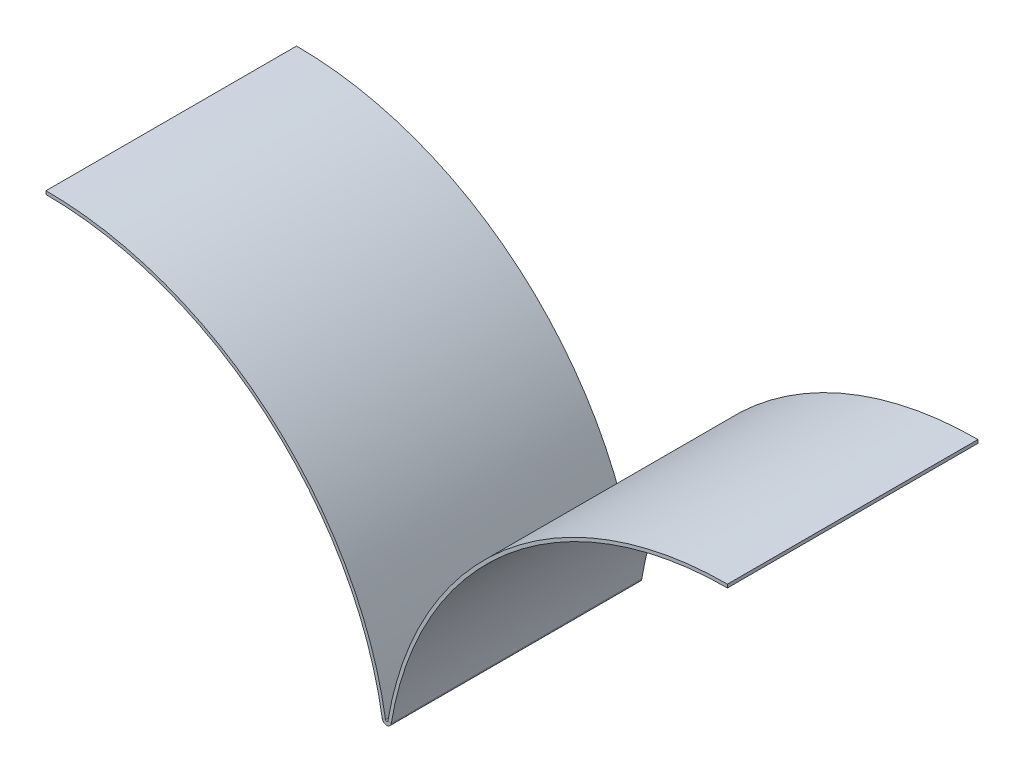
ISO-10303-21;
HEADER;
FILE_DESCRIPTION(('STEP AP214'),'2;1');
FILE_NAME('part.step','',(''),(''),'','','');
FILE_SCHEMA(('AUTOMOTIVE_DESIGN { 1 0 10303 214 1 1 1 1 }'));
ENDSEC;
DATA;
#1=APPLICATION_CONTEXT('core data for automotive mechanical design processes');
#2=APPLICATION_PROTOCOL_DEFINITION('international standard','automotive_design',2000,#1);
#3=PRODUCT_CONTEXT('',#1,'mechanical');
#4=PRODUCT('Part','Part','',(#3));
#5=PRODUCT_RELATED_PRODUCT_CATEGORY('part','',(#4));
#6=PRODUCT_DEFINITION_FORMATION('','',#4);
#7=PRODUCT_DEFINITION_CONTEXT('part definition',#1,'design');
#8=PRODUCT_DEFINITION('design','',#6,#7);
#9=PRODUCT_DEFINITION_SHAPE('','',#8);
#10=(LENGTH_UNIT() NAMED_UNIT(*) SI_UNIT(.MILLI.,.METRE.));
#11=(NAMED_UNIT(*) PLANE_ANGLE_UNIT() SI_UNIT($,.RADIAN.));
#12=(NAMED_UNIT(*) SI_UNIT($,.STERADIAN.) SOLID_ANGLE_UNIT());
#13=UNCERTAINTY_MEASURE_WITH_UNIT(LENGTH_MEASURE(1.E-05),#10,'distance_accuracy_value','');
#14=(GEOMETRIC_REPRESENTATION_CONTEXT(3) GLOBAL_UNCERTAINTY_ASSIGNED_CONTEXT((#13)) GLOBAL_UNIT_ASSIGNED_CONTEXT((#10,
#11,#12)) REPRESENTATION_CONTEXT('',''));
#15=CARTESIAN_POINT('',(0.,0.,0.));
#16=DIRECTION('',(0.,0.,1.));
#17=DIRECTION('',(1.,0.,0.));
#18=AXIS2_PLACEMENT_3D('',#15,#16,#17);
#19=CARTESIAN_POINT('',(-71.7628752601135,-88.5736098456698,150.));
#20=DIRECTION('',(0.,0.,1.));
#21=DIRECTION('',(1.,0.,0.));
#22=AXIS2_PLACEMENT_3D('',#19,#20,#21);
#23=PLANE('',#22);
#24=DIRECTION('',(0.986762866371992,0.162169804678092,0.));
#25=VECTOR('',#24,1.);
#26=CARTESIAN_POINT('',(-71.7628752601135,-88.5736098456698,150.));
#27=LINE('',#26,#25);
#28=CARTESIAN_POINT('',(-71.7628752601135,-88.5736098456698,150.));
#29=VERTEX_POINT('',#28);
#30=CARTESIAN_POINT('',(-69.7893495273696,-88.2492702363136,150.));
#31=VERTEX_POINT('',#30);
#32=EDGE_CURVE('E11',#29,#31,#27,.T.);
#33=ORIENTED_EDGE('',*,*,#32,.F.);
#34=CARTESIAN_POINT('',(-69.0624999999999,-88.1298159581877,150.));
#35=DIRECTION('',(0.,0.,1.));
#36=DIRECTION('',(1.,0.,0.));
#37=AXIS2_PLACEMENT_3D('',#34,#35,#36);
#38=CIRCLE('',#37,2.7366);
#39=CARTESIAN_POINT('',(-66.3621247398864,-88.5736098456698,150.));
#40=VERTEX_POINT('',#39);
#41=EDGE_CURVE('E134',#40,#29,#38,.F.);
#42=ORIENTED_EDGE('',*,*,#41,.F.);
#43=DIRECTION('',(0.986762866371992,-0.162169804678093,0.));
#44=VECTOR('',#43,1.);
#45=CARTESIAN_POINT('',(-68.3356504726303,-88.2492702363136,150.));
#46=LINE('',#45,#44);
#47=CARTESIAN_POINT('',(-68.3356504726303,-88.2492702363136,150.));
#48=VERTEX_POINT('',#47);
#49=EDGE_CURVE('E45',#48,#40,#46,.T.);
#50=ORIENTED_EDGE('',*,*,#49,.F.);
#51=CARTESIAN_POINT('',(-69.0624999999999,-88.1298159581877,150.));
#52=DIRECTION('',(0.,0.,1.));
#53=DIRECTION('',(1.,0.,0.));
#54=AXIS2_PLACEMENT_3D('',#51,#52,#53);
#55=CIRCLE('',#54,0.7366);
#56=EDGE_CURVE('E127',#48,#31,#55,.F.);
#57=ORIENTED_EDGE('',*,*,#56,.T.);
#58=EDGE_LOOP('',(#33,#42,#50,#57));
#59=FACE_BOUND('',#58,.T.);
#60=ADVANCED_FACE('F37',(#59),#23,.T.);
#61=CARTESIAN_POINT('',(-68.3356504726303,-88.2492702363136,150.));
#62=DIRECTION('',(0.,0.,1.));
#63=DIRECTION('',(1.,0.,0.));
#64=AXIS2_PLACEMENT_3D('',#61,#62,#63);
#65=PLANE('',#64);
#66=CARTESIAN_POINT('',(-273.0625,-121.65625,150.));
#67=DIRECTION('',(0.,0.,1.));
#68=DIRECTION('',(1.,0.,0.));
#69=AXIS2_PLACEMENT_3D('',#66,#67,#68);
#70=CIRCLE('',#69,204.);
#71=CARTESIAN_POINT('',(-273.0625,82.34375,150.));
#72=VERTEX_POINT('',#71);
#73=EDGE_CURVE('E183',#29,#72,#70,.T.);
#74=ORIENTED_EDGE('',*,*,#73,.F.);
#75=ORIENTED_EDGE('',*,*,#32,.T.);
#76=CARTESIAN_POINT('',(-273.0625,-121.65625,150.));
#77=DIRECTION('',(0.,0.,1.));
#78=DIRECTION('',(1.,0.,0.));
#79=AXIS2_PLACEMENT_3D('',#76,#77,#78);
#80=CIRCLE('',#79,206.);
#81=CARTESIAN_POINT('',(-273.0625,84.34375,150.));
#82=VERTEX_POINT('',#81);
#83=EDGE_CURVE('E93',#31,#82,#80,.T.);
#84=ORIENTED_EDGE('',*,*,#83,.T.);
#85=DIRECTION('',(0.,1.,0.));
#86=VECTOR('',#85,1.);
#87=CARTESIAN_POINT('',(-273.0625,82.34375,150.));
#88=LINE('',#87,#86);
#89=EDGE_CURVE('E340',#72,#82,#88,.T.);
#90=ORIENTED_EDGE('',*,*,#89,.F.);
#91=EDGE_LOOP('',(#74,#75,#84,#90));
#92=FACE_BOUND('',#91,.T.);
#93=ADVANCED_FACE('F191',(#92),#65,.T.);
#94=CARTESIAN_POINT('',(-66.3621247398864,-88.5736098456698,0.));
#95=DIRECTION('',(0.,0.,-1.));
#96=DIRECTION('',(-1.,0.,0.));
#97=AXIS2_PLACEMENT_3D('',#94,#95,#96);
#98=PLANE('',#97);
#99=DIRECTION('',(-0.986762866371992,0.162169804678093,0.));
#100=VECTOR('',#99,1.);
#101=CARTESIAN_POINT('',(-66.3621247398864,-88.5736098456698,0.));
#102=LINE('',#101,#100);
#103=CARTESIAN_POINT('',(-66.3621247398864,-88.5736098456698,0.));
#104=VERTEX_POINT('',#103);
#105=CARTESIAN_POINT('',(-68.3356504726303,-88.2492702363136,0.));
#106=VERTEX_POINT('',#105);
#107=EDGE_CURVE('E80',#104,#106,#102,.T.);
#108=ORIENTED_EDGE('',*,*,#107,.F.);
#109=CARTESIAN_POINT('',(-69.0624999999999,-88.1298159581877,0.));
#110=DIRECTION('',(0.,0.,1.));
#111=DIRECTION('',(1.,0.,0.));
#112=AXIS2_PLACEMENT_3D('',#109,#110,#111);
#113=CIRCLE('',#112,2.7366);
#114=CARTESIAN_POINT('',(-71.7628752601135,-88.5736098456698,0.));
#115=VERTEX_POINT('',#114);
#116=EDGE_CURVE('E149',#104,#115,#113,.F.);
#117=ORIENTED_EDGE('',*,*,#116,.T.);
#118=DIRECTION('',(-0.986762866371992,-0.162169804678092,0.));
#119=VECTOR('',#118,1.);
#120=CARTESIAN_POINT('',(-69.7893495273696,-88.2492702363136,0.));
#121=LINE('',#120,#119);
#122=CARTESIAN_POINT('',(-69.7893495273696,-88.2492702363136,0.));
#123=VERTEX_POINT('',#122);
#124=EDGE_CURVE('E87',#123,#115,#121,.T.);
#125=ORIENTED_EDGE('',*,*,#124,.F.);
#126=CARTESIAN_POINT('',(-69.0624999999999,-88.1298159581877,0.));
#127=DIRECTION('',(0.,0.,1.));
#128=DIRECTION('',(1.,0.,0.));
#129=AXIS2_PLACEMENT_3D('',#126,#127,#128);
#130=CIRCLE('',#129,0.7366);
#131=EDGE_CURVE('E156',#106,#123,#130,.F.);
#132=ORIENTED_EDGE('',*,*,#131,.F.);
#133=EDGE_LOOP('',(#108,#117,#125,#132));
#134=FACE_BOUND('',#133,.T.);
#135=ADVANCED_FACE('F189',(#134),#98,.T.);
#136=CARTESIAN_POINT('',(-69.7893495273696,-88.2492702363136,0.));
#137=DIRECTION('',(0.,0.,-1.));
#138=DIRECTION('',(-1.,0.,0.));
#139=AXIS2_PLACEMENT_3D('',#136,#137,#138);
#140=PLANE('',#139);
#141=CARTESIAN_POINT('',(134.9375,-121.65625,0.));
#142=DIRECTION('',(0.,0.,1.));
#143=DIRECTION('',(1.,0.,0.));
#144=AXIS2_PLACEMENT_3D('',#141,#142,#143);
#145=CIRCLE('',#144,204.);
#146=CARTESIAN_POINT('',(134.9375,82.34375,0.));
#147=VERTEX_POINT('',#146);
#148=EDGE_CURVE('E151',#147,#104,#145,.T.);
#149=ORIENTED_EDGE('',*,*,#148,.T.);
#150=ORIENTED_EDGE('',*,*,#107,.T.);
#151=CARTESIAN_POINT('',(134.9375,-121.65625,0.));
#152=DIRECTION('',(0.,0.,1.));
#153=DIRECTION('',(1.,0.,0.));
#154=AXIS2_PLACEMENT_3D('',#151,#152,#153);
#155=CIRCLE('',#154,206.);
#156=CARTESIAN_POINT('',(134.9375,84.34375,0.));
#157=VERTEX_POINT('',#156);
#158=EDGE_CURVE('E154',#157,#106,#155,.T.);
#159=ORIENTED_EDGE('',*,*,#158,.F.);
#160=DIRECTION('',(0.,-1.,0.));
#161=VECTOR('',#160,1.);
#162=CARTESIAN_POINT('',(134.9375,84.34375,0.));
#163=LINE('',#162,#161);
#164=EDGE_CURVE('E115',#157,#147,#163,.T.);
#165=ORIENTED_EDGE('',*,*,#164,.T.);
#166=EDGE_LOOP('',(#149,#150,#159,#165));
#167=FACE_BOUND('',#166,.T.);
#168=ADVANCED_FACE('F185',(#167),#140,.T.);
#169=CARTESIAN_POINT('',(-273.0625,-121.65625,150.));
#170=DIRECTION('',(0.,0.,-1.));
#171=DIRECTION('',(-1.,0.,0.));
#172=AXIS2_PLACEMENT_3D('',#169,#170,#171);
#173=CYLINDRICAL_SURFACE('',#172,206.);
#174=CARTESIAN_POINT('',(-273.0625,-121.65625,0.));
#175=DIRECTION('',(0.,0.,1.));
#176=DIRECTION('',(1.,0.,0.));
#177=AXIS2_PLACEMENT_3D('',#174,#175,#176);
#178=CIRCLE('',#177,206.);
#179=CARTESIAN_POINT('',(-273.0625,84.34375,0.));
#180=VERTEX_POINT('',#179);
#181=EDGE_CURVE('E140',#123,#180,#178,.T.);
#182=ORIENTED_EDGE('',*,*,#181,.T.);
#183=DIRECTION('',(0.,0.,-1.));
#184=VECTOR('',#183,1.);
#185=CARTESIAN_POINT('',(-273.0625,84.34375,150.));
#186=LINE('',#185,#184);
#187=EDGE_CURVE('E170',#82,#180,#186,.T.);
#188=ORIENTED_EDGE('',*,*,#187,.F.);
#189=ORIENTED_EDGE('',*,*,#83,.F.);
#190=DIRECTION('',(0.,0.,-1.));
#191=VECTOR('',#190,1.);
#192=CARTESIAN_POINT('',(-69.7893495273696,-88.2492702363136,150.));
#193=LINE('',#192,#191);
#194=EDGE_CURVE('E139',#31,#123,#193,.T.);
#195=ORIENTED_EDGE('',*,*,#194,.T.);
#196=EDGE_LOOP('',(#182,#188,#189,#195));
#197=FACE_BOUND('',#196,.T.);
#198=ADVANCED_FACE('F197',(#197),#173,.T.);
#199=CARTESIAN_POINT('',(-273.0625,82.34375,150.));
#200=DIRECTION('',(-1.,0.,0.));
#201=DIRECTION('',(0.,0.,1.));
#202=AXIS2_PLACEMENT_3D('',#199,#200,#201);
#203=PLANE('',#202);
#204=DIRECTION('',(0.,1.,0.));
#205=VECTOR('',#204,1.);
#206=CARTESIAN_POINT('',(-273.0625,82.34375,0.));
#207=LINE('',#206,#205);
#208=CARTESIAN_POINT('',(-273.0625,82.34375,0.));
#209=VERTEX_POINT('',#208);
#210=EDGE_CURVE('E143',#209,#180,#207,.T.);
#211=ORIENTED_EDGE('',*,*,#210,.F.);
#212=DIRECTION('',(0.,0.,-1.));
#213=VECTOR('',#212,1.);
#214=CARTESIAN_POINT('',(-273.0625,82.34375,150.));
#215=LINE('',#214,#213);
#216=EDGE_CURVE('E168',#72,#209,#215,.T.);
#217=ORIENTED_EDGE('',*,*,#216,.F.);
#218=ORIENTED_EDGE('',*,*,#89,.T.);
#219=ORIENTED_EDGE('',*,*,#187,.T.);
#220=EDGE_LOOP('',(#211,#217,#218,#219));
#221=FACE_BOUND('',#220,.T.);
#222=ADVANCED_FACE('F228',(#221),#203,.T.);
#223=CARTESIAN_POINT('',(-273.0625,-121.65625,150.));
#224=DIRECTION('',(0.,0.,-1.));
#225=DIRECTION('',(-1.,0.,0.));
#226=AXIS2_PLACEMENT_3D('',#223,#224,#225);
#227=CYLINDRICAL_SURFACE('',#226,204.);
#228=CARTESIAN_POINT('',(-273.0625,-121.65625,0.));
#229=DIRECTION('',(0.,0.,1.));
#230=DIRECTION('',(1.,0.,0.));
#231=AXIS2_PLACEMENT_3D('',#228,#229,#230);
#232=CIRCLE('',#231,204.);
#233=EDGE_CURVE('E146',#115,#209,#232,.T.);
#234=ORIENTED_EDGE('',*,*,#233,.F.);
#235=DIRECTION('',(0.,0.,-1.));
#236=VECTOR('',#235,1.);
#237=CARTESIAN_POINT('',(-71.7628752601135,-88.5736098456698,150.));
#238=LINE('',#237,#236);
#239=EDGE_CURVE('E165',#29,#115,#238,.T.);
#240=ORIENTED_EDGE('',*,*,#239,.F.);
#241=ORIENTED_EDGE('',*,*,#73,.T.);
#242=ORIENTED_EDGE('',*,*,#216,.T.);
#243=EDGE_LOOP('',(#234,#240,#241,#242));
#244=FACE_BOUND('',#243,.T.);
#245=ADVANCED_FACE('F239',(#244),#227,.F.);
#246=CARTESIAN_POINT('',(-69.0624999999999,-88.1298159581877,150.));
#247=DIRECTION('',(0.,0.,-1.));
#248=DIRECTION('',(-1.,0.,0.));
#249=AXIS2_PLACEMENT_3D('',#246,#247,#248);
#250=CYLINDRICAL_SURFACE('',#249,2.7366);
#251=ORIENTED_EDGE('',*,*,#116,.F.);
#252=DIRECTION('',(0.,0.,-1.));
#253=VECTOR('',#252,1.);
#254=CARTESIAN_POINT('',(-66.3621247398864,-88.5736098456698,150.));
#255=LINE('',#254,#253);
#256=EDGE_CURVE('E162',#40,#104,#255,.T.);
#257=ORIENTED_EDGE('',*,*,#256,.F.);
#258=ORIENTED_EDGE('',*,*,#41,.T.);
#259=ORIENTED_EDGE('',*,*,#239,.T.);
#260=EDGE_LOOP('',(#251,#257,#258,#259));
#261=FACE_BOUND('',#260,.T.);
#262=ADVANCED_FACE('F179',(#261),#250,.T.);
#263=CARTESIAN_POINT('',(134.9375,-121.65625,150.));
#264=DIRECTION('',(0.,0.,-1.));
#265=DIRECTION('',(-1.,0.,0.));
#266=AXIS2_PLACEMENT_3D('',#263,#264,#265);
#267=CYLINDRICAL_SURFACE('',#266,204.);
#268=ORIENTED_EDGE('',*,*,#148,.F.);
#269=DIRECTION('',(0.,0.,-1.));
#270=VECTOR('',#269,1.);
#271=CARTESIAN_POINT('',(134.9375,82.34375,150.));
#272=LINE('',#271,#270);
#273=CARTESIAN_POINT('',(134.9375,82.34375,150.));
#274=VERTEX_POINT('',#273);
#275=EDGE_CURVE('E117',#274,#147,#272,.T.);
#276=ORIENTED_EDGE('',*,*,#275,.F.);
#277=CARTESIAN_POINT('',(134.9375,-121.65625,150.));
#278=DIRECTION('',(0.,0.,1.));
#279=DIRECTION('',(1.,0.,0.));
#280=AXIS2_PLACEMENT_3D('',#277,#278,#279);
#281=CIRCLE('',#280,204.);
#282=EDGE_CURVE('E132',#274,#40,#281,.T.);
#283=ORIENTED_EDGE('',*,*,#282,.T.);
#284=ORIENTED_EDGE('',*,*,#256,.T.);
#285=EDGE_LOOP('',(#268,#276,#283,#284));
#286=FACE_BOUND('',#285,.T.);
#287=ADVANCED_FACE('F184',(#286),#267,.F.);
#288=CARTESIAN_POINT('',(134.9375,84.34375,150.));
#289=DIRECTION('',(1.,0.,0.));
#290=DIRECTION('',(0.,0.,-1.));
#291=AXIS2_PLACEMENT_3D('',#288,#289,#290);
#292=PLANE('',#291);
#293=ORIENTED_EDGE('',*,*,#164,.F.);
#294=DIRECTION('',(0.,0.,-1.));
#295=VECTOR('',#294,1.);
#296=CARTESIAN_POINT('',(134.9375,84.34375,150.));
#297=LINE('',#296,#295);
#298=CARTESIAN_POINT('',(134.9375,84.34375,150.));
#299=VERTEX_POINT('',#298);
#300=EDGE_CURVE('E109',#299,#157,#297,.T.);
#301=ORIENTED_EDGE('',*,*,#300,.F.);
#302=DIRECTION('',(0.,-1.,0.));
#303=VECTOR('',#302,1.);
#304=CARTESIAN_POINT('',(134.9375,84.34375,150.));
#305=LINE('',#304,#303);
#306=EDGE_CURVE('E113',#299,#274,#305,.T.);
#307=ORIENTED_EDGE('',*,*,#306,.T.);
#308=ORIENTED_EDGE('',*,*,#275,.T.);
#309=EDGE_LOOP('',(#293,#301,#307,#308));
#310=FACE_BOUND('',#309,.T.);
#311=ADVANCED_FACE('F111',(#310),#292,.T.);
#312=CARTESIAN_POINT('',(134.9375,-121.65625,150.));
#313=DIRECTION('',(0.,0.,-1.));
#314=DIRECTION('',(-1.,0.,0.));
#315=AXIS2_PLACEMENT_3D('',#312,#313,#314);
#316=CYLINDRICAL_SURFACE('',#315,206.);
#317=ORIENTED_EDGE('',*,*,#158,.T.);
#318=DIRECTION('',(0.,0.,-1.));
#319=VECTOR('',#318,1.);
#320=CARTESIAN_POINT('',(-68.3356504726303,-88.2492702363136,150.));
#321=LINE('',#320,#319);
#322=EDGE_CURVE('E118',#48,#106,#321,.T.);
#323=ORIENTED_EDGE('',*,*,#322,.F.);
#324=CARTESIAN_POINT('',(134.9375,-121.65625,150.));
#325=DIRECTION('',(0.,0.,1.));
#326=DIRECTION('',(1.,0.,0.));
#327=AXIS2_PLACEMENT_3D('',#324,#325,#326);
#328=CIRCLE('',#327,206.);
#329=EDGE_CURVE('E122',#299,#48,#328,.T.);
#330=ORIENTED_EDGE('',*,*,#329,.F.);
#331=ORIENTED_EDGE('',*,*,#300,.T.);
#332=EDGE_LOOP('',(#317,#323,#330,#331));
#333=FACE_BOUND('',#332,.T.);
#334=ADVANCED_FACE('F123',(#333),#316,.T.);
#335=CARTESIAN_POINT('',(-69.0624999999999,-88.1298159581877,150.));
#336=DIRECTION('',(0.,0.,-1.));
#337=DIRECTION('',(-1.,0.,0.));
#338=AXIS2_PLACEMENT_3D('',#335,#336,#337);
#339=CYLINDRICAL_SURFACE('',#338,0.7366);
#340=ORIENTED_EDGE('',*,*,#131,.T.);
#341=ORIENTED_EDGE('',*,*,#194,.F.);
#342=ORIENTED_EDGE('',*,*,#56,.F.);
#343=ORIENTED_EDGE('',*,*,#322,.T.);
#344=EDGE_LOOP('',(#340,#341,#342,#343));
#345=FACE_BOUND('',#344,.T.);
#346=ADVANCED_FACE('F187',(#345),#339,.F.);
#347=CARTESIAN_POINT('',(-273.0625,-121.65625,150.));
#348=DIRECTION('',(0.,0.,1.));
#349=DIRECTION('',(1.,0.,0.));
#350=AXIS2_PLACEMENT_3D('',#347,#348,#349);
#351=PLANE('',#350);
#352=ORIENTED_EDGE('',*,*,#329,.T.);
#353=ORIENTED_EDGE('',*,*,#49,.T.);
#354=ORIENTED_EDGE('',*,*,#282,.F.);
#355=ORIENTED_EDGE('',*,*,#306,.F.);
#356=EDGE_LOOP('',(#352,#353,#354,#355));
#357=FACE_BOUND('',#356,.T.);
#358=ADVANCED_FACE('F130',(#357),#351,.T.);
#359=CARTESIAN_POINT('',(-273.0625,-121.65625,0.));
#360=DIRECTION('',(0.,0.,1.));
#361=DIRECTION('',(1.,0.,0.));
#362=AXIS2_PLACEMENT_3D('',#359,#360,#361);
#363=PLANE('',#362);
#364=ORIENTED_EDGE('',*,*,#181,.F.);
#365=ORIENTED_EDGE('',*,*,#124,.T.);
#366=ORIENTED_EDGE('',*,*,#233,.T.);
#367=ORIENTED_EDGE('',*,*,#210,.T.);
#368=EDGE_LOOP('',(#364,#365,#366,#367));
#369=FACE_BOUND('',#368,.T.);
#370=ADVANCED_FACE('F305',(#369),#363,.F.);
#371=CLOSED_SHELL('',(#60,#93,#135,#168,#198,#222,#245,#262,#287,#311,#334,#346,#358,#370));
#372=MANIFOLD_SOLID_BREP('B2',#371);
#373=ADVANCED_BREP_SHAPE_REPRESENTATION('',(#18,#372),#14);
#374=SHAPE_DEFINITION_REPRESENTATION(#9,#373);
ENDSEC;
END-ISO-10303-21;
